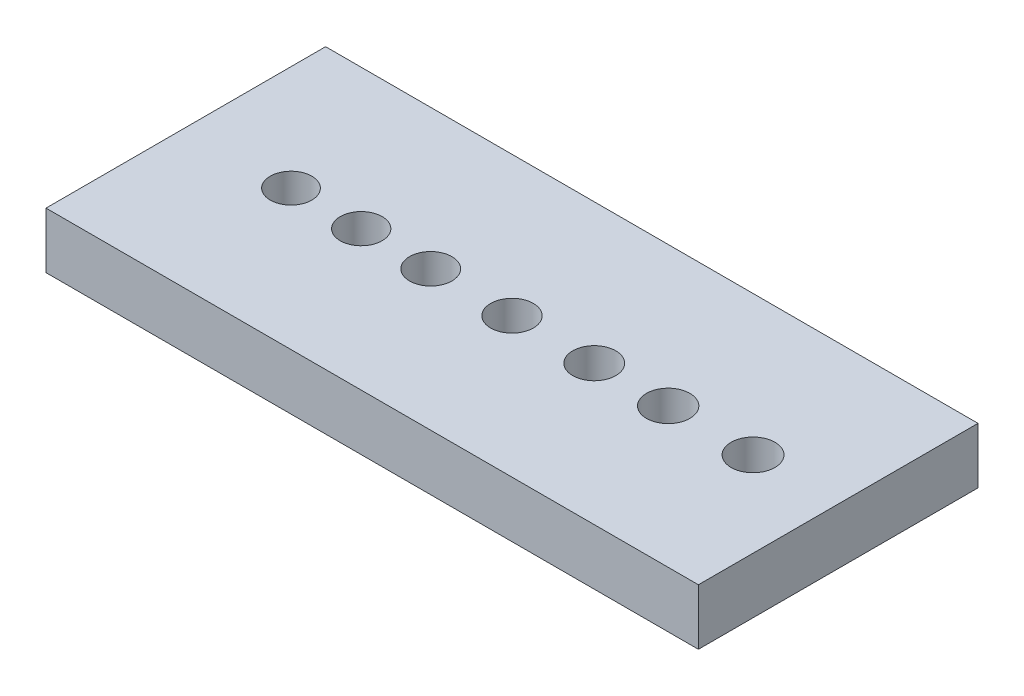
ISO-10303-21;
HEADER;
FILE_DESCRIPTION(('STEP AP214'),'2;1');
FILE_NAME('part.step','',(''),(''),'','','');
FILE_SCHEMA(('AUTOMOTIVE_DESIGN { 1 0 10303 214 1 1 1 1 }'));
ENDSEC;
DATA;
#1=APPLICATION_CONTEXT('core data for automotive mechanical design processes');
#2=APPLICATION_PROTOCOL_DEFINITION('international standard','automotive_design',2000,#1);
#3=PRODUCT_CONTEXT('',#1,'mechanical');
#4=PRODUCT('Part','Part','',(#3));
#5=PRODUCT_RELATED_PRODUCT_CATEGORY('part','',(#4));
#6=PRODUCT_DEFINITION_FORMATION('','',#4);
#7=PRODUCT_DEFINITION_CONTEXT('part definition',#1,'design');
#8=PRODUCT_DEFINITION('design','',#6,#7);
#9=PRODUCT_DEFINITION_SHAPE('','',#8);
#10=(LENGTH_UNIT() NAMED_UNIT(*) SI_UNIT(.MILLI.,.METRE.));
#11=(NAMED_UNIT(*) PLANE_ANGLE_UNIT() SI_UNIT($,.RADIAN.));
#12=(NAMED_UNIT(*) SI_UNIT($,.STERADIAN.) SOLID_ANGLE_UNIT());
#13=UNCERTAINTY_MEASURE_WITH_UNIT(LENGTH_MEASURE(1.E-05),#10,'distance_accuracy_value','');
#14=(GEOMETRIC_REPRESENTATION_CONTEXT(3) GLOBAL_UNCERTAINTY_ASSIGNED_CONTEXT((#13)) GLOBAL_UNIT_ASSIGNED_CONTEXT((#10,
#11,#12)) REPRESENTATION_CONTEXT('',''));
#15=CARTESIAN_POINT('',(0.,0.,0.));
#16=DIRECTION('',(0.,0.,1.));
#17=DIRECTION('',(1.,0.,0.));
#18=AXIS2_PLACEMENT_3D('',#15,#16,#17);
#19=CARTESIAN_POINT('',(0.,3.,0.));
#20=DIRECTION('',(0.,1.,0.));
#21=DIRECTION('',(0.,0.,1.));
#22=AXIS2_PLACEMENT_3D('',#19,#20,#21);
#23=PLANE('',#22);
#24=CARTESIAN_POINT('',(8.37855068824389,3.,0.));
#25=DIRECTION('',(0.,1.,0.));
#26=DIRECTION('',(0.,0.,1.));
#27=AXIS2_PLACEMENT_3D('',#24,#25,#26);
#28=CIRCLE('',#27,1.165);
#29=CARTESIAN_POINT('',(8.37855068824389,3.,1.165));
#30=VERTEX_POINT('',#29);
#31=EDGE_CURVE('E168',#30,#30,#28,.T.);
#32=ORIENTED_EDGE('',*,*,#31,.F.);
#33=EDGE_LOOP('',(#32));
#34=FACE_BOUND('',#33,.T.);
#35=CARTESIAN_POINT('',(0.,3.,0.));
#36=DIRECTION('',(0.,1.,0.));
#37=DIRECTION('',(0.,0.,1.));
#38=AXIS2_PLACEMENT_3D('',#35,#36,#37);
#39=CIRCLE('',#38,1.145);
#40=CARTESIAN_POINT('',(0.,3.,1.145));
#41=VERTEX_POINT('',#40);
#42=EDGE_CURVE('E152',#41,#41,#39,.T.);
#43=ORIENTED_EDGE('',*,*,#42,.F.);
#44=EDGE_LOOP('',(#43));
#45=FACE_BOUND('',#44,.T.);
#46=CARTESIAN_POINT('',(-8.08908995854961,3.,0.));
#47=DIRECTION('',(0.,1.,0.));
#48=DIRECTION('',(0.,0.,1.));
#49=AXIS2_PLACEMENT_3D('',#46,#47,#48);
#50=CIRCLE('',#49,1.125);
#51=CARTESIAN_POINT('',(-8.08908995854961,3.,1.125));
#52=VERTEX_POINT('',#51);
#53=EDGE_CURVE('E136',#52,#52,#50,.T.);
#54=ORIENTED_EDGE('',*,*,#53,.F.);
#55=EDGE_LOOP('',(#54));
#56=FACE_BOUND('',#55,.T.);
#57=DIRECTION('',(0.,0.,1.));
#58=VECTOR('',#57,1.);
#59=CARTESIAN_POINT('',(-17.5,3.,-7.5));
#60=LINE('',#59,#58);
#61=CARTESIAN_POINT('',(-17.5,3.,-7.5));
#62=VERTEX_POINT('',#61);
#63=CARTESIAN_POINT('',(-17.5,3.,7.5));
#64=VERTEX_POINT('',#63);
#65=EDGE_CURVE('E94',#62,#64,#60,.T.);
#66=ORIENTED_EDGE('',*,*,#65,.T.);
#67=DIRECTION('',(1.,0.,0.));
#68=VECTOR('',#67,1.);
#69=CARTESIAN_POINT('',(-17.5,3.,7.5));
#70=LINE('',#69,#68);
#71=CARTESIAN_POINT('',(17.5,3.,7.5));
#72=VERTEX_POINT('',#71);
#73=EDGE_CURVE('E89',#64,#72,#70,.T.);
#74=ORIENTED_EDGE('',*,*,#73,.T.);
#75=DIRECTION('',(0.,0.,-1.));
#76=VECTOR('',#75,1.);
#77=CARTESIAN_POINT('',(17.5,3.,-7.5));
#78=LINE('',#77,#76);
#79=CARTESIAN_POINT('',(17.5,3.,-7.5));
#80=VERTEX_POINT('',#79);
#81=EDGE_CURVE('E92',#72,#80,#78,.T.);
#82=ORIENTED_EDGE('',*,*,#81,.T.);
#83=DIRECTION('',(-1.,0.,0.));
#84=VECTOR('',#83,1.);
#85=CARTESIAN_POINT('',(-17.5,3.,-7.5));
#86=LINE('',#85,#84);
#87=EDGE_CURVE('E59',#80,#62,#86,.T.);
#88=ORIENTED_EDGE('',*,*,#87,.T.);
#89=EDGE_LOOP('',(#66,#74,#82,#88));
#90=FACE_BOUND('',#89,.T.);
#91=CARTESIAN_POINT('',(-11.8544997946152,3.,0.));
#92=DIRECTION('',(0.,1.,0.));
#93=DIRECTION('',(0.,0.,1.));
#94=AXIS2_PLACEMENT_3D('',#91,#92,#93);
#95=CIRCLE('',#94,1.115);
#96=CARTESIAN_POINT('',(-11.8544997946152,3.,1.115));
#97=VERTEX_POINT('',#96);
#98=EDGE_CURVE('E114',#97,#97,#95,.T.);
#99=ORIENTED_EDGE('',*,*,#98,.F.);
#100=EDGE_LOOP('',(#99));
#101=FACE_BOUND('',#100,.T.);
#102=CARTESIAN_POINT('',(-4.36023749953321,3.,0.));
#103=DIRECTION('',(0.,1.,0.));
#104=DIRECTION('',(0.,0.,1.));
#105=AXIS2_PLACEMENT_3D('',#102,#103,#104);
#106=CIRCLE('',#105,1.135);
#107=CARTESIAN_POINT('',(-4.36023749953321,3.,1.135));
#108=VERTEX_POINT('',#107);
#109=EDGE_CURVE('E144',#108,#108,#106,.T.);
#110=ORIENTED_EDGE('',*,*,#109,.F.);
#111=EDGE_LOOP('',(#110));
#112=FACE_BOUND('',#111,.T.);
#113=CARTESIAN_POINT('',(4.41353299227005,3.,0.));
#114=DIRECTION('',(0.,1.,0.));
#115=DIRECTION('',(0.,0.,1.));
#116=AXIS2_PLACEMENT_3D('',#113,#114,#115);
#117=CIRCLE('',#116,1.155);
#118=CARTESIAN_POINT('',(4.41353299227005,3.,1.155));
#119=VERTEX_POINT('',#118);
#120=EDGE_CURVE('E160',#119,#119,#117,.T.);
#121=ORIENTED_EDGE('',*,*,#120,.F.);
#122=EDGE_LOOP('',(#121));
#123=FACE_BOUND('',#122,.T.);
#124=CARTESIAN_POINT('',(12.9314018447291,3.,0.));
#125=DIRECTION('',(0.,1.,0.));
#126=DIRECTION('',(0.,0.,1.));
#127=AXIS2_PLACEMENT_3D('',#124,#125,#126);
#128=CIRCLE('',#127,1.175);
#129=CARTESIAN_POINT('',(12.9314018447291,3.,1.175));
#130=VERTEX_POINT('',#129);
#131=EDGE_CURVE('E176',#130,#130,#128,.T.);
#132=ORIENTED_EDGE('',*,*,#131,.F.);
#133=EDGE_LOOP('',(#132));
#134=FACE_BOUND('',#133,.T.);
#135=ADVANCED_FACE('F41',(#34,#45,#56,#90,#101,#112,#123,#134),#23,.T.);
#136=CARTESIAN_POINT('',(0.,0.,0.));
#137=DIRECTION('',(0.,1.,0.));
#138=DIRECTION('',(0.,0.,1.));
#139=AXIS2_PLACEMENT_3D('',#136,#137,#138);
#140=PLANE('',#139);
#141=DIRECTION('',(0.,0.,1.));
#142=VECTOR('',#141,1.);
#143=CARTESIAN_POINT('',(-17.5,0.,-7.5));
#144=LINE('',#143,#142);
#145=CARTESIAN_POINT('',(-17.5,0.,-7.5));
#146=VERTEX_POINT('',#145);
#147=CARTESIAN_POINT('',(-17.5,0.,7.5));
#148=VERTEX_POINT('',#147);
#149=EDGE_CURVE('E110',#146,#148,#144,.T.);
#150=ORIENTED_EDGE('',*,*,#149,.F.);
#151=DIRECTION('',(-1.,0.,0.));
#152=VECTOR('',#151,1.);
#153=CARTESIAN_POINT('',(-17.5,0.,-7.5));
#154=LINE('',#153,#152);
#155=CARTESIAN_POINT('',(17.5,0.,-7.5));
#156=VERTEX_POINT('',#155);
#157=EDGE_CURVE('E82',#156,#146,#154,.T.);
#158=ORIENTED_EDGE('',*,*,#157,.F.);
#159=DIRECTION('',(0.,0.,-1.));
#160=VECTOR('',#159,1.);
#161=CARTESIAN_POINT('',(17.5,0.,-7.5));
#162=LINE('',#161,#160);
#163=CARTESIAN_POINT('',(17.5,0.,7.5));
#164=VERTEX_POINT('',#163);
#165=EDGE_CURVE('E76',#164,#156,#162,.T.);
#166=ORIENTED_EDGE('',*,*,#165,.F.);
#167=DIRECTION('',(1.,0.,0.));
#168=VECTOR('',#167,1.);
#169=CARTESIAN_POINT('',(-17.5,0.,7.5));
#170=LINE('',#169,#168);
#171=EDGE_CURVE('E99',#148,#164,#170,.T.);
#172=ORIENTED_EDGE('',*,*,#171,.F.);
#173=EDGE_LOOP('',(#150,#158,#166,#172));
#174=FACE_BOUND('',#173,.T.);
#175=CARTESIAN_POINT('',(-11.8544997946152,0.,0.));
#176=DIRECTION('',(0.,1.,0.));
#177=DIRECTION('',(0.,0.,1.));
#178=AXIS2_PLACEMENT_3D('',#175,#176,#177);
#179=CIRCLE('',#178,1.115);
#180=CARTESIAN_POINT('',(-11.8544997946152,0.,1.115));
#181=VERTEX_POINT('',#180);
#182=EDGE_CURVE('E132',#181,#181,#179,.T.);
#183=ORIENTED_EDGE('',*,*,#182,.T.);
#184=EDGE_LOOP('',(#183));
#185=FACE_BOUND('',#184,.T.);
#186=CARTESIAN_POINT('',(-8.08908995854961,0.,0.));
#187=DIRECTION('',(0.,1.,0.));
#188=DIRECTION('',(0.,0.,1.));
#189=AXIS2_PLACEMENT_3D('',#186,#187,#188);
#190=CIRCLE('',#189,1.125);
#191=CARTESIAN_POINT('',(-8.08908995854961,0.,1.125));
#192=VERTEX_POINT('',#191);
#193=EDGE_CURVE('E140',#192,#192,#190,.T.);
#194=ORIENTED_EDGE('',*,*,#193,.T.);
#195=EDGE_LOOP('',(#194));
#196=FACE_BOUND('',#195,.T.);
#197=CARTESIAN_POINT('',(-4.36023749953321,0.,0.));
#198=DIRECTION('',(0.,1.,0.));
#199=DIRECTION('',(0.,0.,1.));
#200=AXIS2_PLACEMENT_3D('',#197,#198,#199);
#201=CIRCLE('',#200,1.135);
#202=CARTESIAN_POINT('',(-4.36023749953321,0.,1.135));
#203=VERTEX_POINT('',#202);
#204=EDGE_CURVE('E148',#203,#203,#201,.T.);
#205=ORIENTED_EDGE('',*,*,#204,.T.);
#206=EDGE_LOOP('',(#205));
#207=FACE_BOUND('',#206,.T.);
#208=CARTESIAN_POINT('',(0.,0.,0.));
#209=DIRECTION('',(0.,1.,0.));
#210=DIRECTION('',(0.,0.,1.));
#211=AXIS2_PLACEMENT_3D('',#208,#209,#210);
#212=CIRCLE('',#211,1.145);
#213=CARTESIAN_POINT('',(0.,0.,1.145));
#214=VERTEX_POINT('',#213);
#215=EDGE_CURVE('E156',#214,#214,#212,.T.);
#216=ORIENTED_EDGE('',*,*,#215,.T.);
#217=EDGE_LOOP('',(#216));
#218=FACE_BOUND('',#217,.T.);
#219=CARTESIAN_POINT('',(4.41353299227005,0.,0.));
#220=DIRECTION('',(0.,1.,0.));
#221=DIRECTION('',(0.,0.,1.));
#222=AXIS2_PLACEMENT_3D('',#219,#220,#221);
#223=CIRCLE('',#222,1.155);
#224=CARTESIAN_POINT('',(4.41353299227005,0.,1.155));
#225=VERTEX_POINT('',#224);
#226=EDGE_CURVE('E164',#225,#225,#223,.T.);
#227=ORIENTED_EDGE('',*,*,#226,.T.);
#228=EDGE_LOOP('',(#227));
#229=FACE_BOUND('',#228,.T.);
#230=CARTESIAN_POINT('',(8.37855068824389,0.,0.));
#231=DIRECTION('',(0.,1.,0.));
#232=DIRECTION('',(0.,0.,1.));
#233=AXIS2_PLACEMENT_3D('',#230,#231,#232);
#234=CIRCLE('',#233,1.165);
#235=CARTESIAN_POINT('',(8.37855068824389,0.,1.165));
#236=VERTEX_POINT('',#235);
#237=EDGE_CURVE('E172',#236,#236,#234,.T.);
#238=ORIENTED_EDGE('',*,*,#237,.T.);
#239=EDGE_LOOP('',(#238));
#240=FACE_BOUND('',#239,.T.);
#241=CARTESIAN_POINT('',(12.9314018447291,0.,0.));
#242=DIRECTION('',(0.,1.,0.));
#243=DIRECTION('',(0.,0.,1.));
#244=AXIS2_PLACEMENT_3D('',#241,#242,#243);
#245=CIRCLE('',#244,1.175);
#246=CARTESIAN_POINT('',(12.9314018447291,0.,1.175));
#247=VERTEX_POINT('',#246);
#248=EDGE_CURVE('E180',#247,#247,#245,.T.);
#249=ORIENTED_EDGE('',*,*,#248,.T.);
#250=EDGE_LOOP('',(#249));
#251=FACE_BOUND('',#250,.T.);
#252=ADVANCED_FACE('F127',(#174,#185,#196,#207,#218,#229,#240,#251),#140,.F.);
#253=CARTESIAN_POINT('',(-17.5,3.,-7.5));
#254=DIRECTION('',(1.,0.,0.));
#255=DIRECTION('',(0.,0.,-1.));
#256=AXIS2_PLACEMENT_3D('',#253,#254,#255);
#257=PLANE('',#256);
#258=ORIENTED_EDGE('',*,*,#149,.T.);
#259=DIRECTION('',(0.,-1.,0.));
#260=VECTOR('',#259,1.);
#261=CARTESIAN_POINT('',(-17.5,3.,7.5));
#262=LINE('',#261,#260);
#263=EDGE_CURVE('E11',#64,#148,#262,.T.);
#264=ORIENTED_EDGE('',*,*,#263,.F.);
#265=ORIENTED_EDGE('',*,*,#65,.F.);
#266=DIRECTION('',(0.,-1.,0.));
#267=VECTOR('',#266,1.);
#268=CARTESIAN_POINT('',(-17.5,3.,-7.5));
#269=LINE('',#268,#267);
#270=EDGE_CURVE('E106',#62,#146,#269,.T.);
#271=ORIENTED_EDGE('',*,*,#270,.T.);
#272=EDGE_LOOP('',(#258,#264,#265,#271));
#273=FACE_BOUND('',#272,.T.);
#274=ADVANCED_FACE('F43',(#273),#257,.F.);
#275=CARTESIAN_POINT('',(-17.5,3.,7.5));
#276=DIRECTION('',(0.,0.,-1.));
#277=DIRECTION('',(-1.,0.,0.));
#278=AXIS2_PLACEMENT_3D('',#275,#276,#277);
#279=PLANE('',#278);
#280=ORIENTED_EDGE('',*,*,#171,.T.);
#281=DIRECTION('',(0.,-1.,0.));
#282=VECTOR('',#281,1.);
#283=CARTESIAN_POINT('',(17.5,3.,7.5));
#284=LINE('',#283,#282);
#285=EDGE_CURVE('E51',#72,#164,#284,.T.);
#286=ORIENTED_EDGE('',*,*,#285,.F.);
#287=ORIENTED_EDGE('',*,*,#73,.F.);
#288=ORIENTED_EDGE('',*,*,#263,.T.);
#289=EDGE_LOOP('',(#280,#286,#287,#288));
#290=FACE_BOUND('',#289,.T.);
#291=ADVANCED_FACE('F98',(#290),#279,.F.);
#292=CARTESIAN_POINT('',(17.5,3.,-7.5));
#293=DIRECTION('',(-1.,0.,0.));
#294=DIRECTION('',(0.,0.,1.));
#295=AXIS2_PLACEMENT_3D('',#292,#293,#294);
#296=PLANE('',#295);
#297=ORIENTED_EDGE('',*,*,#165,.T.);
#298=DIRECTION('',(0.,-1.,0.));
#299=VECTOR('',#298,1.);
#300=CARTESIAN_POINT('',(17.5,3.,-7.5));
#301=LINE('',#300,#299);
#302=EDGE_CURVE('E101',#80,#156,#301,.T.);
#303=ORIENTED_EDGE('',*,*,#302,.F.);
#304=ORIENTED_EDGE('',*,*,#81,.F.);
#305=ORIENTED_EDGE('',*,*,#285,.T.);
#306=EDGE_LOOP('',(#297,#303,#304,#305));
#307=FACE_BOUND('',#306,.T.);
#308=ADVANCED_FACE('F102',(#307),#296,.F.);
#309=CARTESIAN_POINT('',(-17.5,3.,-7.5));
#310=DIRECTION('',(0.,0.,1.));
#311=DIRECTION('',(1.,0.,0.));
#312=AXIS2_PLACEMENT_3D('',#309,#310,#311);
#313=PLANE('',#312);
#314=ORIENTED_EDGE('',*,*,#157,.T.);
#315=ORIENTED_EDGE('',*,*,#270,.F.);
#316=ORIENTED_EDGE('',*,*,#87,.F.);
#317=ORIENTED_EDGE('',*,*,#302,.T.);
#318=EDGE_LOOP('',(#314,#315,#316,#317));
#319=FACE_BOUND('',#318,.T.);
#320=ADVANCED_FACE('F124',(#319),#313,.F.);
#321=CARTESIAN_POINT('',(-11.8544997946152,3.,0.));
#322=DIRECTION('',(0.,-1.,0.));
#323=DIRECTION('',(0.,0.,-1.));
#324=AXIS2_PLACEMENT_3D('',#321,#322,#323);
#325=CYLINDRICAL_SURFACE('',#324,1.115);
#326=ORIENTED_EDGE('',*,*,#98,.T.);
#327=EDGE_LOOP('',(#326));
#328=FACE_BOUND('',#327,.T.);
#329=ORIENTED_EDGE('',*,*,#182,.F.);
#330=EDGE_LOOP('',(#329));
#331=FACE_BOUND('',#330,.T.);
#332=ADVANCED_FACE('F201',(#328,#331),#325,.F.);
#333=CARTESIAN_POINT('',(-8.08908995854961,3.,0.));
#334=DIRECTION('',(0.,-1.,0.));
#335=DIRECTION('',(0.,0.,-1.));
#336=AXIS2_PLACEMENT_3D('',#333,#334,#335);
#337=CYLINDRICAL_SURFACE('',#336,1.125);
#338=ORIENTED_EDGE('',*,*,#53,.T.);
#339=EDGE_LOOP('',(#338));
#340=FACE_BOUND('',#339,.T.);
#341=ORIENTED_EDGE('',*,*,#193,.F.);
#342=EDGE_LOOP('',(#341));
#343=FACE_BOUND('',#342,.T.);
#344=ADVANCED_FACE('F253',(#340,#343),#337,.F.);
#345=CARTESIAN_POINT('',(-4.36023749953321,3.,0.));
#346=DIRECTION('',(0.,-1.,0.));
#347=DIRECTION('',(0.,0.,-1.));
#348=AXIS2_PLACEMENT_3D('',#345,#346,#347);
#349=CYLINDRICAL_SURFACE('',#348,1.135);
#350=ORIENTED_EDGE('',*,*,#109,.T.);
#351=EDGE_LOOP('',(#350));
#352=FACE_BOUND('',#351,.T.);
#353=ORIENTED_EDGE('',*,*,#204,.F.);
#354=EDGE_LOOP('',(#353));
#355=FACE_BOUND('',#354,.T.);
#356=ADVANCED_FACE('F262',(#352,#355),#349,.F.);
#357=CARTESIAN_POINT('',(0.,3.,0.));
#358=DIRECTION('',(0.,-1.,0.));
#359=DIRECTION('',(0.,0.,-1.));
#360=AXIS2_PLACEMENT_3D('',#357,#358,#359);
#361=CYLINDRICAL_SURFACE('',#360,1.145);
#362=ORIENTED_EDGE('',*,*,#42,.T.);
#363=EDGE_LOOP('',(#362));
#364=FACE_BOUND('',#363,.T.);
#365=ORIENTED_EDGE('',*,*,#215,.F.);
#366=EDGE_LOOP('',(#365));
#367=FACE_BOUND('',#366,.T.);
#368=ADVANCED_FACE('F271',(#364,#367),#361,.F.);
#369=CARTESIAN_POINT('',(4.41353299227005,3.,0.));
#370=DIRECTION('',(0.,-1.,0.));
#371=DIRECTION('',(0.,0.,-1.));
#372=AXIS2_PLACEMENT_3D('',#369,#370,#371);
#373=CYLINDRICAL_SURFACE('',#372,1.155);
#374=ORIENTED_EDGE('',*,*,#120,.T.);
#375=EDGE_LOOP('',(#374));
#376=FACE_BOUND('',#375,.T.);
#377=ORIENTED_EDGE('',*,*,#226,.F.);
#378=EDGE_LOOP('',(#377));
#379=FACE_BOUND('',#378,.T.);
#380=ADVANCED_FACE('F281',(#376,#379),#373,.F.);
#381=CARTESIAN_POINT('',(8.37855068824389,3.,0.));
#382=DIRECTION('',(0.,-1.,0.));
#383=DIRECTION('',(0.,0.,-1.));
#384=AXIS2_PLACEMENT_3D('',#381,#382,#383);
#385=CYLINDRICAL_SURFACE('',#384,1.165);
#386=ORIENTED_EDGE('',*,*,#31,.T.);
#387=EDGE_LOOP('',(#386));
#388=FACE_BOUND('',#387,.T.);
#389=ORIENTED_EDGE('',*,*,#237,.F.);
#390=EDGE_LOOP('',(#389));
#391=FACE_BOUND('',#390,.T.);
#392=ADVANCED_FACE('F291',(#388,#391),#385,.F.);
#393=CARTESIAN_POINT('',(12.9314018447291,3.,0.));
#394=DIRECTION('',(0.,-1.,0.));
#395=DIRECTION('',(0.,0.,-1.));
#396=AXIS2_PLACEMENT_3D('',#393,#394,#395);
#397=CYLINDRICAL_SURFACE('',#396,1.175);
#398=ORIENTED_EDGE('',*,*,#131,.T.);
#399=EDGE_LOOP('',(#398));
#400=FACE_BOUND('',#399,.T.);
#401=ORIENTED_EDGE('',*,*,#248,.F.);
#402=EDGE_LOOP('',(#401));
#403=FACE_BOUND('',#402,.T.);
#404=ADVANCED_FACE('F188',(#400,#403),#397,.F.);
#405=CLOSED_SHELL('',(#135,#252,#274,#291,#308,#320,#332,#344,#356,#368,#380,#392,#404));
#406=MANIFOLD_SOLID_BREP('B2',#405);
#407=ADVANCED_BREP_SHAPE_REPRESENTATION('',(#18,#406),#14);
#408=SHAPE_DEFINITION_REPRESENTATION(#9,#407);
ENDSEC;
END-ISO-10303-21;
